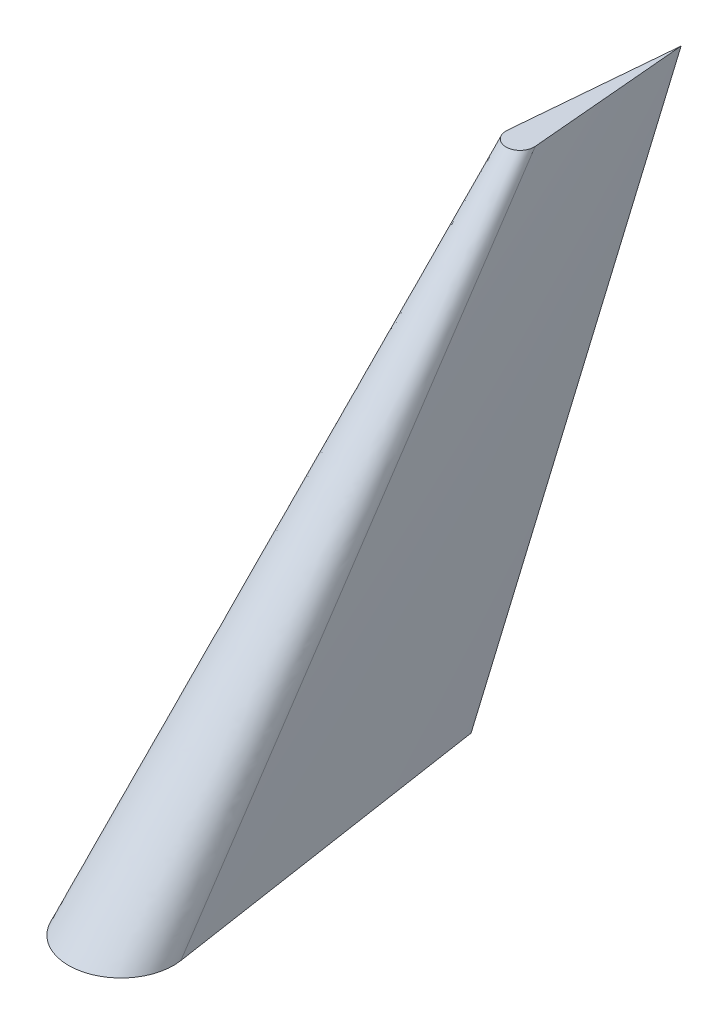
ISO-10303-21;
HEADER;
FILE_DESCRIPTION(('STEP AP214'),'2;1');
FILE_NAME('part.step','',(''),(''),'','','');
FILE_SCHEMA(('AUTOMOTIVE_DESIGN { 1 0 10303 214 1 1 1 1 }'));
ENDSEC;
DATA;
#1=APPLICATION_CONTEXT('core data for automotive mechanical design processes');
#2=APPLICATION_PROTOCOL_DEFINITION('international standard','automotive_design',2000,#1);
#3=PRODUCT_CONTEXT('',#1,'mechanical');
#4=PRODUCT('Part','Part','',(#3));
#5=PRODUCT_RELATED_PRODUCT_CATEGORY('part','',(#4));
#6=PRODUCT_DEFINITION_FORMATION('','',#4);
#7=PRODUCT_DEFINITION_CONTEXT('part definition',#1,'design');
#8=PRODUCT_DEFINITION('design','',#6,#7);
#9=PRODUCT_DEFINITION_SHAPE('','',#8);
#10=(LENGTH_UNIT() NAMED_UNIT(*) SI_UNIT(.MILLI.,.METRE.));
#11=(NAMED_UNIT(*) PLANE_ANGLE_UNIT() SI_UNIT($,.RADIAN.));
#12=(NAMED_UNIT(*) SI_UNIT($,.STERADIAN.) SOLID_ANGLE_UNIT());
#13=UNCERTAINTY_MEASURE_WITH_UNIT(LENGTH_MEASURE(1.E-05),#10,'distance_accuracy_value','');
#14=(GEOMETRIC_REPRESENTATION_CONTEXT(3) GLOBAL_UNCERTAINTY_ASSIGNED_CONTEXT((#13)) GLOBAL_UNIT_ASSIGNED_CONTEXT((#10,
#11,#12)) REPRESENTATION_CONTEXT('',''));
#15=CARTESIAN_POINT('',(0.,0.,0.));
#16=DIRECTION('',(0.,0.,1.));
#17=DIRECTION('',(1.,0.,0.));
#18=AXIS2_PLACEMENT_3D('',#15,#16,#17);
#19=CARTESIAN_POINT('',(0.,775.,-3520.));
#20=DIRECTION('',(0.,1.,0.));
#21=DIRECTION('',(0.,0.,1.));
#22=AXIS2_PLACEMENT_3D('',#19,#20,#21);
#23=PLANE('',#22);
#24=CARTESIAN_POINT('',(0.,775.,-3520.));
#25=DIRECTION('',(0.,1.,0.));
#26=DIRECTION('',(0.,0.,1.));
#27=AXIS2_PLACEMENT_3D('',#24,#25,#26);
#28=CIRCLE('',#27,19.9999999999999);
#29=CARTESIAN_POINT('',(-19.9242421519818,775.,-3521.73913043478));
#30=VERTEX_POINT('',#29);
#31=CARTESIAN_POINT('',(19.9242421519818,775.,-3521.73913043478));
#32=VERTEX_POINT('',#31);
#33=EDGE_CURVE('E230',#30,#32,#28,.T.);
#34=ORIENTED_EDGE('',*,*,#33,.T.);
#35=DIRECTION('',(-0.0869565217391301,0.,-0.996212107599096));
#36=VECTOR('',#35,1.);
#37=CARTESIAN_POINT('',(0.,775.,-3750.));
#38=LINE('',#37,#36);
#39=CARTESIAN_POINT('',(0.,775.,-3750.));
#40=VERTEX_POINT('',#39);
#41=EDGE_CURVE('E88',#32,#40,#38,.T.);
#42=ORIENTED_EDGE('',*,*,#41,.T.);
#43=DIRECTION('',(-0.0869565217391301,0.,0.996212107599096));
#44=VECTOR('',#43,1.);
#45=CARTESIAN_POINT('',(-19.9242421519818,775.,-3521.73913043478));
#46=LINE('',#45,#44);
#47=EDGE_CURVE('E12',#40,#30,#46,.T.);
#48=ORIENTED_EDGE('',*,*,#47,.T.);
#49=EDGE_LOOP('',(#34,#42,#48));
#50=FACE_BOUND('',#49,.T.);
#51=ADVANCED_FACE('F78',(#50),#23,.T.);
#52=CARTESIAN_POINT('',(0.,75.,-2950.));
#53=DIRECTION('',(0.,1.,0.));
#54=DIRECTION('',(0.,0.,1.));
#55=AXIS2_PLACEMENT_3D('',#52,#53,#54);
#56=PLANE('',#55);
#57=CARTESIAN_POINT('',(0.,75.,-2950.));
#58=DIRECTION('',(0.,1.,0.));
#59=DIRECTION('',(0.,0.,1.));
#60=AXIS2_PLACEMENT_3D('',#57,#58,#59);
#61=CIRCLE('',#60,75.);
#62=CARTESIAN_POINT('',(-74.1514497498194,75.,-2961.25));
#63=VERTEX_POINT('',#62);
#64=CARTESIAN_POINT('',(74.1514497498194,75.,-2961.25));
#65=VERTEX_POINT('',#64);
#66=EDGE_CURVE('E121',#63,#65,#61,.T.);
#67=ORIENTED_EDGE('',*,*,#66,.F.);
#68=DIRECTION('',(-0.15,0.,0.988685996664259));
#69=VECTOR('',#68,1.);
#70=CARTESIAN_POINT('',(-74.1514497498194,75.,-2961.25));
#71=LINE('',#70,#69);
#72=CARTESIAN_POINT('',(0.,75.,-3450.));
#73=VERTEX_POINT('',#72);
#74=EDGE_CURVE('E116',#73,#63,#71,.T.);
#75=ORIENTED_EDGE('',*,*,#74,.F.);
#76=DIRECTION('',(-0.15,0.,-0.988685996664259));
#77=VECTOR('',#76,1.);
#78=CARTESIAN_POINT('',(0.,75.,-3450.));
#79=LINE('',#78,#77);
#80=EDGE_CURVE('E127',#65,#73,#79,.T.);
#81=ORIENTED_EDGE('',*,*,#80,.F.);
#82=EDGE_LOOP('',(#67,#75,#81));
#83=FACE_BOUND('',#82,.T.);
#84=ADVANCED_FACE('F131',(#83),#56,.F.);
#85=CARTESIAN_POINT('',(74.1514497498194,75.,-2961.25));
#86=CARTESIAN_POINT('',(19.9242421519818,775.,-3521.73913043478));
#87=CARTESIAN_POINT('',(0.,75.,-3450.));
#88=CARTESIAN_POINT('',(0.,775.,-3750.));
#89=B_SPLINE_SURFACE_WITH_KNOTS('',1,1,((#85,#86),(#87,#88)),.UNSPECIFIED.,.F.,.F.,.F.,(2,2),(2,
2),(0.,1.),(0.,1.),.UNSPECIFIED.);
#90=DIRECTION('',(0.,0.919145030018058,-0.393919298579167));
#91=VECTOR('',#90,1.);
#92=CARTESIAN_POINT('',(0.,425.,-3600.));
#93=LINE('',#92,#91);
#94=EDGE_CURVE('E96',#73,#40,#93,.T.);
#95=DIRECTION('',(0.0603610269244636,-0.779179321946303,0.623887915157781));
#96=VECTOR('',#95,1.);
#97=CARTESIAN_POINT('',(47.0378459509006,425.,-3241.49456521739));
#98=LINE('',#97,#96);
#99=EDGE_CURVE('E126',#32,#65,#98,.T.);
#100=ORIENTED_EDGE('',*,*,#80,.T.);
#101=ORIENTED_EDGE('',*,*,#94,.T.);
#102=ORIENTED_EDGE('',*,*,#41,.F.);
#103=ORIENTED_EDGE('',*,*,#99,.T.);
#104=EDGE_LOOP('',(#100,#101,#102,#103));
#105=FACE_BOUND('',#104,.T.);
#106=ADVANCED_FACE('F152',(#105),#89,.T.);
#107=CARTESIAN_POINT('',(0.,75.,-3450.));
#108=CARTESIAN_POINT('',(0.,775.,-3750.));
#109=CARTESIAN_POINT('',(-6.71805685559934,75.,-3405.7196750805));
#110=CARTESIAN_POINT('',(-1.52895495580593,775.,-3732.4836204521));
#111=CARTESIAN_POINT('',(-19.2504145462942,75.,-3323.11589805398));
#112=CARTESIAN_POINT('',(-4.75880371905132,775.000000000001,-3695.48105435002));
#113=CARTESIAN_POINT('',(-37.0757248749097,75.,-3205.625));
#114=CARTESIAN_POINT('',(-9.96212107599093,774.999999999999,-3635.86956521739));
#115=CARTESIAN_POINT('',(-54.9010352035254,75.,-3088.13410194602));
#116=CARTESIAN_POINT('',(-15.1654384329306,775.,-3576.25807608476));
#117=CARTESIAN_POINT('',(-67.4333928942201,75.,-3005.5303249195));
#118=CARTESIAN_POINT('',(-18.3952871961759,775.,-3539.25550998268));
#119=CARTESIAN_POINT('',(-74.8236470554496,75.,-2956.81938624619));
#120=CARTESIAN_POINT('',(-20.077226775893,775.,-3519.98647138669));
#121=CARTESIAN_POINT('',(-75.408458315139,74.9999999999998,-2947.60272769831));
#122=CARTESIAN_POINT('',(-19.9080391919017,774.999999999999,-3516.66977431945));
#123=CARTESIAN_POINT('',(-73.5838687376749,75.0000000000002,-2933.12064901053));
#124=CARTESIAN_POINT('',(-18.6290011232062,775.000000000001,-3512.29413797979));
#125=CARTESIAN_POINT('',(-68.6951990133107,74.9999999999999,-2918.56467058202));
#126=CARTESIAN_POINT('',(-16.5711650940679,774.999999999998,-3508.54711629892));
#127=CARTESIAN_POINT('',(-60.5174647413048,75.0000000000001,-2904.69401147952));
#128=CARTESIAN_POINT('',(-13.914867676004,775.,-3505.45097946969));
#129=CARTESIAN_POINT('',(-49.0545174700379,75.0000000000001,-2892.41587073944));
#130=CARTESIAN_POINT('',(-10.8119489539031,775.,-3503.02552593186));
#131=CARTESIAN_POINT('',(-34.6291045297519,74.9999999999999,-2882.70093275341));
#132=CARTESIAN_POINT('',(-7.38156197584059,774.999999999999,-3501.28253959266));
#133=CARTESIAN_POINT('',(-17.9336735843965,75.,-2876.44199537318));
#134=CARTESIAN_POINT('',(-3.74285978989165,775.,-3500.23380435931));
#135=CARTESIAN_POINT('',(-3.24393290007663E-13,75.,-2874.27797554298));
#136=CARTESIAN_POINT('',(4.01696904905879E-13,775.000000000001,-3499.88299951909));
#137=CARTESIAN_POINT('',(17.9336735843956,75.,-2876.44199537319));
#138=CARTESIAN_POINT('',(3.74285978989228,775.,-3500.23380435931));
#139=CARTESIAN_POINT('',(34.6291045297518,75.0000000000001,-2882.7009327534));
#140=CARTESIAN_POINT('',(7.38156197584116,774.999999999999,-3501.28253959267));
#141=CARTESIAN_POINT('',(49.0545174700376,74.9999999999997,-2892.41587073946));
#142=CARTESIAN_POINT('',(10.8119489539042,775.,-3503.02552593186));
#143=CARTESIAN_POINT('',(60.5174647413053,75.0000000000003,-2904.69401147951));
#144=CARTESIAN_POINT('',(13.9148676760053,775.,-3505.45097946969));
#145=CARTESIAN_POINT('',(68.6951990133106,74.9999999999999,-2918.56467058203));
#146=CARTESIAN_POINT('',(16.5711650940683,774.999999999999,-3508.54711629894));
#147=CARTESIAN_POINT('',(73.5838687376745,74.9999999999999,-2933.12064901052));
#148=CARTESIAN_POINT('',(18.6290011232066,775.000000000001,-3512.29413797978));
#149=CARTESIAN_POINT('',(75.4084583151391,75.0000000000001,-2947.60272769831));
#150=CARTESIAN_POINT('',(19.9080391919019,774.999999999999,-3516.66977431947));
#151=CARTESIAN_POINT('',(74.8236470554496,75.,-2956.81938624619));
#152=CARTESIAN_POINT('',(20.077226775893,775.,-3519.98647138669));
#153=CARTESIAN_POINT('',(74.1514497498194,75.,-2961.25));
#154=CARTESIAN_POINT('',(19.9242421519818,775.,-3521.73913043478));
#155=B_SPLINE_SURFACE_WITH_KNOTS('',3,1,((#107,#108),(#109,#110),(#111,#112),(#113,#114),(#115,
#116),(#117,#118),(#119,#120),(#121,#122),(#123,#124),(#125,#126),(#127,#128),(#129,#130),(#131,
#132),(#133,#134),(#135,#136),(#137,#138),(#139,#140),(#141,#142),(#143,#144),(#145,#146),(#147,
#148),(#149,#150),(#151,#152),(#153,#154)),.UNSPECIFIED.,.F.,.F.,.F.,(4,1,1,1,2,1,1,1,1,1,1,1,1,
1,1,1,1,1,1,1,4),(2,2),(0.,0.178541691386023,0.357083382772046,0.535625074158069,
0.714166765544092,0.732031342697586,0.74989591985108,0.767760497004575,0.785625074158069,
0.803489651311563,0.821354228465057,0.839218805618552,0.857083382772046,0.87494795992554,
0.892812537079035,0.910677114232529,0.928541691386023,0.946406268539517,0.964270845693012,
0.982135422846506,1.),(0.,1.),.UNSPECIFIED.);
#156=ORIENTED_EDGE('',*,*,#74,.T.);
#157=ORIENTED_EDGE('',*,*,#66,.T.);
#158=ORIENTED_EDGE('',*,*,#99,.F.);
#159=ORIENTED_EDGE('',*,*,#33,.F.);
#160=ORIENTED_EDGE('',*,*,#47,.F.);
#161=ORIENTED_EDGE('',*,*,#94,.F.);
#162=EDGE_LOOP('',(#156,#157,#158,#159,#160,#161));
#163=FACE_BOUND('',#162,.T.);
#164=ADVANCED_FACE('F119',(#163),#155,.T.);
#165=CLOSED_SHELL('',(#51,#84,#106,#164));
#166=MANIFOLD_SOLID_BREP('B2',#165);
#167=ADVANCED_BREP_SHAPE_REPRESENTATION('',(#18,#166),#14);
#168=SHAPE_DEFINITION_REPRESENTATION(#9,#167);
ENDSEC;
END-ISO-10303-21;
